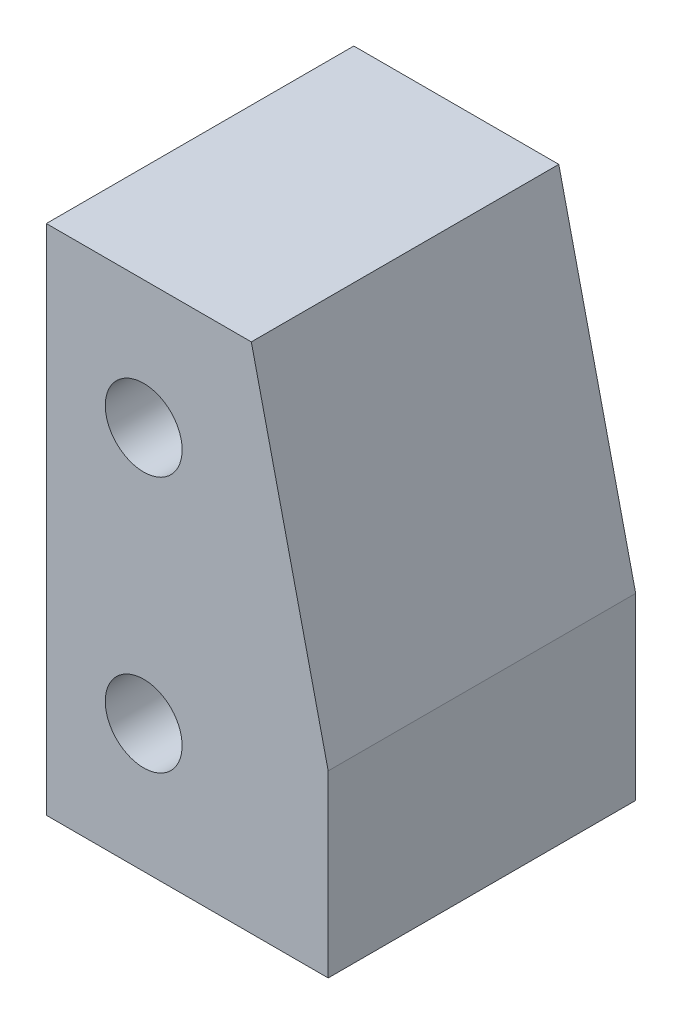
ISO-10303-21;
HEADER;
FILE_DESCRIPTION(('STEP AP214'),'2;1');
FILE_NAME('part.step','',(''),(''),'','','');
FILE_SCHEMA(('AUTOMOTIVE_DESIGN { 1 0 10303 214 1 1 1 1 }'));
ENDSEC;
DATA;
#1=APPLICATION_CONTEXT('core data for automotive mechanical design processes');
#2=APPLICATION_PROTOCOL_DEFINITION('international standard','automotive_design',2000,#1);
#3=PRODUCT_CONTEXT('',#1,'mechanical');
#4=PRODUCT('Part','Part','',(#3));
#5=PRODUCT_RELATED_PRODUCT_CATEGORY('part','',(#4));
#6=PRODUCT_DEFINITION_FORMATION('','',#4);
#7=PRODUCT_DEFINITION_CONTEXT('part definition',#1,'design');
#8=PRODUCT_DEFINITION('design','',#6,#7);
#9=PRODUCT_DEFINITION_SHAPE('','',#8);
#10=(LENGTH_UNIT() NAMED_UNIT(*) SI_UNIT(.MILLI.,.METRE.));
#11=(NAMED_UNIT(*) PLANE_ANGLE_UNIT() SI_UNIT($,.RADIAN.));
#12=(NAMED_UNIT(*) SI_UNIT($,.STERADIAN.) SOLID_ANGLE_UNIT());
#13=UNCERTAINTY_MEASURE_WITH_UNIT(LENGTH_MEASURE(1.E-05),#10,'distance_accuracy_value','');
#14=(GEOMETRIC_REPRESENTATION_CONTEXT(3) GLOBAL_UNCERTAINTY_ASSIGNED_CONTEXT((#13)) GLOBAL_UNIT_ASSIGNED_CONTEXT((#10,
#11,#12)) REPRESENTATION_CONTEXT('',''));
#15=CARTESIAN_POINT('',(0.,0.,0.));
#16=DIRECTION('',(0.,0.,1.));
#17=DIRECTION('',(1.,0.,0.));
#18=AXIS2_PLACEMENT_3D('',#15,#16,#17);
#19=CARTESIAN_POINT('',(0.,0.,12.));
#20=DIRECTION('',(0.,0.,-1.));
#21=DIRECTION('',(-1.,0.,0.));
#22=AXIS2_PLACEMENT_3D('',#19,#20,#21);
#23=PLANE('',#22);
#24=DIRECTION('',(0.,-1.,0.));
#25=VECTOR('',#24,1.);
#26=CARTESIAN_POINT('',(0.,0.,12.));
#27=LINE('',#26,#25);
#28=CARTESIAN_POINT('',(0.,20.,12.));
#29=VERTEX_POINT('',#28);
#30=CARTESIAN_POINT('',(0.,0.,12.));
#31=VERTEX_POINT('',#30);
#32=EDGE_CURVE('E129',#29,#31,#27,.T.);
#33=ORIENTED_EDGE('',*,*,#32,.T.);
#34=DIRECTION('',(1.,0.,0.));
#35=VECTOR('',#34,1.);
#36=CARTESIAN_POINT('',(0.,0.,12.));
#37=LINE('',#36,#35);
#38=CARTESIAN_POINT('',(11.,0.,12.));
#39=VERTEX_POINT('',#38);
#40=EDGE_CURVE('E76',#31,#39,#37,.T.);
#41=ORIENTED_EDGE('',*,*,#40,.T.);
#42=DIRECTION('',(0.,1.,0.));
#43=VECTOR('',#42,1.);
#44=CARTESIAN_POINT('',(11.,7.,12.));
#45=LINE('',#44,#43);
#46=CARTESIAN_POINT('',(11.,7.,12.));
#47=VERTEX_POINT('',#46);
#48=EDGE_CURVE('E111',#39,#47,#45,.T.);
#49=ORIENTED_EDGE('',*,*,#48,.T.);
#50=DIRECTION('',(-0.224859506698758,0.97439119569462,0.));
#51=VECTOR('',#50,1.);
#52=CARTESIAN_POINT('',(8.,20.,12.));
#53=LINE('',#52,#51);
#54=CARTESIAN_POINT('',(8.,20.,12.));
#55=VERTEX_POINT('',#54);
#56=EDGE_CURVE('E112',#47,#55,#53,.T.);
#57=ORIENTED_EDGE('',*,*,#56,.T.);
#58=DIRECTION('',(-1.,0.,0.));
#59=VECTOR('',#58,1.);
#60=CARTESIAN_POINT('',(0.,20.,12.));
#61=LINE('',#60,#59);
#62=EDGE_CURVE('E55',#55,#29,#61,.T.);
#63=ORIENTED_EDGE('',*,*,#62,.T.);
#64=EDGE_LOOP('',(#33,#41,#49,#57,#63));
#65=FACE_BOUND('',#64,.T.);
#66=CARTESIAN_POINT('',(3.80000000000003,15.,12.));
#67=DIRECTION('',(0.,0.,1.));
#68=DIRECTION('',(1.,0.,0.));
#69=AXIS2_PLACEMENT_3D('',#66,#67,#68);
#70=CIRCLE('',#69,1.5);
#71=CARTESIAN_POINT('',(5.30000000000003,15.,12.));
#72=VERTEX_POINT('',#71);
#73=EDGE_CURVE('E124',#72,#72,#70,.T.);
#74=ORIENTED_EDGE('',*,*,#73,.F.);
#75=EDGE_LOOP('',(#74));
#76=FACE_BOUND('',#75,.T.);
#77=CARTESIAN_POINT('',(3.80000000000003,5.,12.));
#78=DIRECTION('',(0.,0.,1.));
#79=DIRECTION('',(-1.,0.,0.));
#80=AXIS2_PLACEMENT_3D('',#77,#78,#79);
#81=CIRCLE('',#80,1.5);
#82=CARTESIAN_POINT('',(2.30000000000003,5.,12.));
#83=VERTEX_POINT('',#82);
#84=EDGE_CURVE('E117',#83,#83,#81,.T.);
#85=ORIENTED_EDGE('',*,*,#84,.F.);
#86=EDGE_LOOP('',(#85));
#87=FACE_BOUND('',#86,.T.);
#88=ADVANCED_FACE('F37',(#65,#76,#87),#23,.F.);
#89=CARTESIAN_POINT('',(0.,0.,0.));
#90=DIRECTION('',(0.,0.,-1.));
#91=DIRECTION('',(-1.,0.,0.));
#92=AXIS2_PLACEMENT_3D('',#89,#90,#91);
#93=PLANE('',#92);
#94=CARTESIAN_POINT('',(3.80000000000003,15.,0.));
#95=DIRECTION('',(0.,0.,1.));
#96=DIRECTION('',(1.,0.,0.));
#97=AXIS2_PLACEMENT_3D('',#94,#95,#96);
#98=CIRCLE('',#97,1.5);
#99=CARTESIAN_POINT('',(5.30000000000003,15.,0.));
#100=VERTEX_POINT('',#99);
#101=EDGE_CURVE('E120',#100,#100,#98,.T.);
#102=ORIENTED_EDGE('',*,*,#101,.T.);
#103=EDGE_LOOP('',(#102));
#104=FACE_BOUND('',#103,.T.);
#105=DIRECTION('',(0.,-1.,0.));
#106=VECTOR('',#105,1.);
#107=CARTESIAN_POINT('',(0.,0.,0.));
#108=LINE('',#107,#106);
#109=CARTESIAN_POINT('',(0.,20.,0.));
#110=VERTEX_POINT('',#109);
#111=CARTESIAN_POINT('',(0.,0.,0.));
#112=VERTEX_POINT('',#111);
#113=EDGE_CURVE('E97',#110,#112,#108,.T.);
#114=ORIENTED_EDGE('',*,*,#113,.F.);
#115=DIRECTION('',(-1.,0.,0.));
#116=VECTOR('',#115,1.);
#117=CARTESIAN_POINT('',(0.,20.,0.));
#118=LINE('',#117,#116);
#119=CARTESIAN_POINT('',(8.,20.,0.));
#120=VERTEX_POINT('',#119);
#121=EDGE_CURVE('E70',#120,#110,#118,.T.);
#122=ORIENTED_EDGE('',*,*,#121,.F.);
#123=DIRECTION('',(-0.224859506698758,0.97439119569462,0.));
#124=VECTOR('',#123,1.);
#125=CARTESIAN_POINT('',(8.,20.,0.));
#126=LINE('',#125,#124);
#127=CARTESIAN_POINT('',(11.,7.,0.));
#128=VERTEX_POINT('',#127);
#129=EDGE_CURVE('E104',#128,#120,#126,.T.);
#130=ORIENTED_EDGE('',*,*,#129,.F.);
#131=DIRECTION('',(0.,1.,0.));
#132=VECTOR('',#131,1.);
#133=CARTESIAN_POINT('',(11.,7.,0.));
#134=LINE('',#133,#132);
#135=CARTESIAN_POINT('',(11.,0.,0.));
#136=VERTEX_POINT('',#135);
#137=EDGE_CURVE('E100',#136,#128,#134,.T.);
#138=ORIENTED_EDGE('',*,*,#137,.F.);
#139=DIRECTION('',(1.,0.,0.));
#140=VECTOR('',#139,1.);
#141=CARTESIAN_POINT('',(0.,0.,0.));
#142=LINE('',#141,#140);
#143=EDGE_CURVE('E87',#112,#136,#142,.T.);
#144=ORIENTED_EDGE('',*,*,#143,.F.);
#145=EDGE_LOOP('',(#114,#122,#130,#138,#144));
#146=FACE_BOUND('',#145,.T.);
#147=CARTESIAN_POINT('',(3.80000000000003,5.,0.));
#148=DIRECTION('',(0.,0.,1.));
#149=DIRECTION('',(-1.,0.,0.));
#150=AXIS2_PLACEMENT_3D('',#147,#148,#149);
#151=CIRCLE('',#150,1.5);
#152=CARTESIAN_POINT('',(2.30000000000003,5.,0.));
#153=VERTEX_POINT('',#152);
#154=EDGE_CURVE('E121',#153,#153,#151,.T.);
#155=ORIENTED_EDGE('',*,*,#154,.T.);
#156=EDGE_LOOP('',(#155));
#157=FACE_BOUND('',#156,.T.);
#158=ADVANCED_FACE('F101',(#104,#146,#157),#93,.T.);
#159=CARTESIAN_POINT('',(0.,0.,12.));
#160=DIRECTION('',(1.,0.,0.));
#161=DIRECTION('',(0.,0.,-1.));
#162=AXIS2_PLACEMENT_3D('',#159,#160,#161);
#163=PLANE('',#162);
#164=ORIENTED_EDGE('',*,*,#113,.T.);
#165=DIRECTION('',(0.,0.,-1.));
#166=VECTOR('',#165,1.);
#167=CARTESIAN_POINT('',(0.,0.,12.));
#168=LINE('',#167,#166);
#169=EDGE_CURVE('E11',#31,#112,#168,.T.);
#170=ORIENTED_EDGE('',*,*,#169,.F.);
#171=ORIENTED_EDGE('',*,*,#32,.F.);
#172=DIRECTION('',(0.,0.,-1.));
#173=VECTOR('',#172,1.);
#174=CARTESIAN_POINT('',(0.,20.,12.));
#175=LINE('',#174,#173);
#176=EDGE_CURVE('E133',#29,#110,#175,.T.);
#177=ORIENTED_EDGE('',*,*,#176,.T.);
#178=EDGE_LOOP('',(#164,#170,#171,#177));
#179=FACE_BOUND('',#178,.T.);
#180=ADVANCED_FACE('F39',(#179),#163,.F.);
#181=CARTESIAN_POINT('',(0.,0.,12.));
#182=DIRECTION('',(0.,1.,0.));
#183=DIRECTION('',(0.,0.,1.));
#184=AXIS2_PLACEMENT_3D('',#181,#182,#183);
#185=PLANE('',#184);
#186=CARTESIAN_POINT('',(8.00000000000001,0.,6.));
#187=DIRECTION('',(0.,1.,0.));
#188=DIRECTION('',(0.,0.,1.));
#189=AXIS2_PLACEMENT_3D('',#186,#187,#188);
#190=CIRCLE('',#189,1.25);
#191=CARTESIAN_POINT('',(8.00000000000001,0.,7.25));
#192=VERTEX_POINT('',#191);
#193=EDGE_CURVE('E41',#192,#192,#190,.F.);
#194=ORIENTED_EDGE('',*,*,#193,.F.);
#195=EDGE_LOOP('',(#194));
#196=FACE_BOUND('',#195,.T.);
#197=ORIENTED_EDGE('',*,*,#143,.T.);
#198=DIRECTION('',(0.,0.,1.));
#199=VECTOR('',#198,1.);
#200=CARTESIAN_POINT('',(11.,0.,-20.2237484161567));
#201=LINE('',#200,#199);
#202=EDGE_CURVE('E91',#136,#39,#201,.T.);
#203=ORIENTED_EDGE('',*,*,#202,.T.);
#204=ORIENTED_EDGE('',*,*,#40,.F.);
#205=ORIENTED_EDGE('',*,*,#169,.T.);
#206=EDGE_LOOP('',(#197,#203,#204,#205));
#207=FACE_BOUND('',#206,.T.);
#208=ADVANCED_FACE('F89',(#196,#207),#185,.F.);
#209=CARTESIAN_POINT('',(0.,20.,12.));
#210=DIRECTION('',(0.,-1.,0.));
#211=DIRECTION('',(0.,0.,-1.));
#212=AXIS2_PLACEMENT_3D('',#209,#210,#211);
#213=PLANE('',#212);
#214=ORIENTED_EDGE('',*,*,#121,.T.);
#215=ORIENTED_EDGE('',*,*,#176,.F.);
#216=ORIENTED_EDGE('',*,*,#62,.F.);
#217=DIRECTION('',(0.,0.,-1.));
#218=VECTOR('',#217,1.);
#219=CARTESIAN_POINT('',(8.,20.,12.));
#220=LINE('',#219,#218);
#221=EDGE_CURVE('E47',#55,#120,#220,.T.);
#222=ORIENTED_EDGE('',*,*,#221,.T.);
#223=EDGE_LOOP('',(#214,#215,#216,#222));
#224=FACE_BOUND('',#223,.T.);
#225=ADVANCED_FACE('F155',(#224),#213,.F.);
#226=CARTESIAN_POINT('',(3.80000000000003,15.,12.));
#227=DIRECTION('',(0.,0.,-1.));
#228=DIRECTION('',(-1.,0.,0.));
#229=AXIS2_PLACEMENT_3D('',#226,#227,#228);
#230=CYLINDRICAL_SURFACE('',#229,1.5);
#231=ORIENTED_EDGE('',*,*,#73,.T.);
#232=EDGE_LOOP('',(#231));
#233=FACE_BOUND('',#232,.T.);
#234=ORIENTED_EDGE('',*,*,#101,.F.);
#235=EDGE_LOOP('',(#234));
#236=FACE_BOUND('',#235,.T.);
#237=ADVANCED_FACE('F160',(#233,#236),#230,.F.);
#238=CARTESIAN_POINT('',(3.80000000000003,5.,12.));
#239=DIRECTION('',(0.,0.,-1.));
#240=DIRECTION('',(-1.,0.,0.));
#241=AXIS2_PLACEMENT_3D('',#238,#239,#240);
#242=CYLINDRICAL_SURFACE('',#241,1.5);
#243=ORIENTED_EDGE('',*,*,#84,.T.);
#244=EDGE_LOOP('',(#243));
#245=FACE_BOUND('',#244,.T.);
#246=ORIENTED_EDGE('',*,*,#154,.F.);
#247=EDGE_LOOP('',(#246));
#248=FACE_BOUND('',#247,.T.);
#249=ADVANCED_FACE('F173',(#245,#248),#242,.F.);
#250=CARTESIAN_POINT('',(11.,7.,-20.2237484161567));
#251=DIRECTION('',(1.,0.,0.));
#252=DIRECTION('',(0.,0.,-1.));
#253=AXIS2_PLACEMENT_3D('',#250,#251,#252);
#254=PLANE('',#253);
#255=ORIENTED_EDGE('',*,*,#202,.F.);
#256=ORIENTED_EDGE('',*,*,#137,.T.);
#257=DIRECTION('',(0.,0.,1.));
#258=VECTOR('',#257,1.);
#259=CARTESIAN_POINT('',(11.,7.,-20.2237484161567));
#260=LINE('',#259,#258);
#261=EDGE_CURVE('E107',#128,#47,#260,.T.);
#262=ORIENTED_EDGE('',*,*,#261,.T.);
#263=ORIENTED_EDGE('',*,*,#48,.F.);
#264=EDGE_LOOP('',(#255,#256,#262,#263));
#265=FACE_BOUND('',#264,.T.);
#266=ADVANCED_FACE('F109',(#265),#254,.T.);
#267=CARTESIAN_POINT('',(8.,20.,-20.2237484161567));
#268=DIRECTION('',(0.97439119569462,0.224859506698758,0.));
#269=DIRECTION('',(-0.224859506698758,0.97439119569462,0.));
#270=AXIS2_PLACEMENT_3D('',#267,#268,#269);
#271=PLANE('',#270);
#272=ORIENTED_EDGE('',*,*,#261,.F.);
#273=ORIENTED_EDGE('',*,*,#129,.T.);
#274=ORIENTED_EDGE('',*,*,#221,.F.);
#275=ORIENTED_EDGE('',*,*,#56,.F.);
#276=EDGE_LOOP('',(#272,#273,#274,#275));
#277=FACE_BOUND('',#276,.T.);
#278=ADVANCED_FACE('F140',(#277),#271,.T.);
#279=CARTESIAN_POINT('',(8.00000000000001,-1.2E-05,6.));
#280=DIRECTION('',(0.,1.,0.));
#281=DIRECTION('',(0.,0.,1.));
#282=AXIS2_PLACEMENT_3D('',#279,#280,#281);
#283=CYLINDRICAL_SURFACE('',#282,1.25);
#284=CARTESIAN_POINT('',(8.00000000000001,7.,6.));
#285=DIRECTION('',(0.,-1.,0.));
#286=DIRECTION('',(0.,0.,-1.));
#287=AXIS2_PLACEMENT_3D('',#284,#285,#286);
#288=CIRCLE('',#287,1.25);
#289=CARTESIAN_POINT('',(8.00000000000001,7.,7.25));
#290=VERTEX_POINT('',#289);
#291=EDGE_CURVE('E145',#290,#290,#288,.T.);
#292=CARTESIAN_POINT('',(8.00000000000001,7.,7.25));
#293=CARTESIAN_POINT('',(8.00000000000001,6.92708333333333,7.25));
#294=CARTESIAN_POINT('',(8.00000000000001,6.85416666666667,7.25));
#295=CARTESIAN_POINT('',(8.00000000000001,6.70833333333333,7.25));
#296=CARTESIAN_POINT('',(8.00000000000001,6.63541666666667,7.25));
#297=CARTESIAN_POINT('',(8.00000000000001,6.48958333333333,7.25));
#298=CARTESIAN_POINT('',(8.00000000000001,6.41666666666667,7.25));
#299=CARTESIAN_POINT('',(8.00000000000001,6.27083333333333,7.25));
#300=CARTESIAN_POINT('',(8.00000000000001,6.19791666666667,7.25));
#301=CARTESIAN_POINT('',(8.00000000000001,6.05208333333333,7.25));
#302=CARTESIAN_POINT('',(8.00000000000001,5.97916666666667,7.25));
#303=CARTESIAN_POINT('',(8.00000000000001,5.83333333333333,7.25));
#304=CARTESIAN_POINT('',(8.00000000000001,5.76041666666667,7.25));
#305=CARTESIAN_POINT('',(8.00000000000001,5.61458333333333,7.25));
#306=CARTESIAN_POINT('',(8.00000000000001,5.54166666666667,7.25));
#307=CARTESIAN_POINT('',(8.00000000000001,5.39583333333333,7.25));
#308=CARTESIAN_POINT('',(8.00000000000001,5.32291666666667,7.25));
#309=CARTESIAN_POINT('',(8.00000000000001,5.17708333333333,7.25));
#310=CARTESIAN_POINT('',(8.00000000000001,5.10416666666667,7.25));
#311=CARTESIAN_POINT('',(8.00000000000001,4.95833333333333,7.25));
#312=CARTESIAN_POINT('',(8.00000000000001,4.88541666666667,7.25));
#313=CARTESIAN_POINT('',(8.00000000000001,4.73958333333333,7.25));
#314=CARTESIAN_POINT('',(8.00000000000001,4.66666666666667,7.25));
#315=CARTESIAN_POINT('',(8.00000000000001,4.52083333333333,7.25));
#316=CARTESIAN_POINT('',(8.00000000000001,4.44791666666667,7.25));
#317=CARTESIAN_POINT('',(8.00000000000001,4.30208333333333,7.25));
#318=CARTESIAN_POINT('',(8.00000000000001,4.22916666666667,7.25));
#319=CARTESIAN_POINT('',(8.00000000000001,4.08333333333333,7.25));
#320=CARTESIAN_POINT('',(8.00000000000001,4.01041666666667,7.25));
#321=CARTESIAN_POINT('',(8.00000000000001,3.86458333333333,7.25));
#322=CARTESIAN_POINT('',(8.00000000000001,3.79166666666667,7.25));
#323=CARTESIAN_POINT('',(8.00000000000001,3.64583333333333,7.25));
#324=CARTESIAN_POINT('',(8.00000000000001,3.57291666666667,7.25));
#325=CARTESIAN_POINT('',(8.00000000000001,3.42708333333333,7.25));
#326=CARTESIAN_POINT('',(8.00000000000001,3.35416666666667,7.25));
#327=CARTESIAN_POINT('',(8.00000000000001,3.20833333333333,7.25));
#328=CARTESIAN_POINT('',(8.00000000000001,3.13541666666667,7.25));
#329=CARTESIAN_POINT('',(8.00000000000001,2.98958333333333,7.25));
#330=CARTESIAN_POINT('',(8.00000000000001,2.91666666666667,7.25));
#331=CARTESIAN_POINT('',(8.00000000000001,2.77083333333333,7.25));
#332=CARTESIAN_POINT('',(8.00000000000001,2.69791666666667,7.25));
#333=CARTESIAN_POINT('',(8.00000000000001,2.55208333333333,7.25));
#334=CARTESIAN_POINT('',(8.00000000000001,2.47916666666667,7.25));
#335=CARTESIAN_POINT('',(8.00000000000001,2.33333333333333,7.25));
#336=CARTESIAN_POINT('',(8.00000000000001,2.26041666666667,7.25));
#337=CARTESIAN_POINT('',(8.00000000000001,2.11458333333333,7.25));
#338=CARTESIAN_POINT('',(8.00000000000001,2.04166666666667,7.25));
#339=CARTESIAN_POINT('',(8.00000000000001,1.89583333333333,7.25));
#340=CARTESIAN_POINT('',(8.00000000000001,1.82291666666667,7.25));
#341=CARTESIAN_POINT('',(8.00000000000001,1.67708333333333,7.25));
#342=CARTESIAN_POINT('',(8.00000000000001,1.60416666666667,7.25));
#343=CARTESIAN_POINT('',(8.00000000000001,1.45833333333333,7.25));
#344=CARTESIAN_POINT('',(8.00000000000001,1.38541666666667,7.25));
#345=CARTESIAN_POINT('',(8.00000000000001,1.23958333333333,7.25));
#346=CARTESIAN_POINT('',(8.00000000000001,1.16666666666667,7.25));
#347=CARTESIAN_POINT('',(8.00000000000001,1.02083333333333,7.25));
#348=CARTESIAN_POINT('',(8.00000000000001,0.947916666666666,7.25));
#349=CARTESIAN_POINT('',(8.00000000000001,0.802083333333333,7.25));
#350=CARTESIAN_POINT('',(8.00000000000001,0.729166666666667,7.25));
#351=CARTESIAN_POINT('',(8.00000000000001,0.583333333333333,7.25));
#352=CARTESIAN_POINT('',(8.00000000000001,0.510416666666667,7.25));
#353=CARTESIAN_POINT('',(8.00000000000001,0.364583333333333,7.25));
#354=CARTESIAN_POINT('',(8.00000000000001,0.291666666666667,7.25));
#355=CARTESIAN_POINT('',(8.00000000000001,0.145833333333333,7.25));
#356=CARTESIAN_POINT('',(8.00000000000001,0.0729166666666664,7.25));
#357=CARTESIAN_POINT('',(8.00000000000001,0.,7.25));
#358=B_SPLINE_CURVE_WITH_KNOTS('',3,(#292,#293,#294,#295,#296,#297,#298,#299,#300,#301,#302,
#303,#304,#305,#306,#307,#308,#309,#310,#311,#312,#313,#314,#315,#316,#317,#318,#319,#320,#321,
#322,#323,#324,#325,#326,#327,#328,#329,#330,#331,#332,#333,#334,#335,#336,#337,#338,#339,#340,
#341,#342,#343,#344,#345,#346,#347,#348,#349,#350,#351,#352,#353,#354,#355,#356,#357),
.UNSPECIFIED.,.F.,.F.,(4,2,2,2,2,2,2,2,2,2,2,2,2,2,2,2,2,2,2,2,2,2,2,2,2,2,2,2,2,2,2,2,4),(0.,
0.21875,0.4375,0.656250000000001,0.875,1.09375,1.3125,1.53125,1.75,1.96875,2.1875,2.40625,2.625,
2.84375,3.0625,3.28125,3.5,3.71875,3.9375,4.15625,4.375,4.59375,4.8125,5.03125,5.25,5.46875,
5.6875,5.90625,6.125,6.34375,6.5625,6.78125,7.),.UNSPECIFIED.);
#359=EDGE_CURVE('BSEAM152',#290,#192,#358,.T.);
#360=ORIENTED_EDGE('',*,*,#291,.F.);
#361=ORIENTED_EDGE('',*,*,#193,.T.);
#362=ORIENTED_EDGE('',*,*,#359,.T.);
#363=ORIENTED_EDGE('',*,*,#359,.F.);
#364=EDGE_LOOP('',(#360,#362,#361,#363));
#365=FACE_BOUND('',#364,.T.);
#366=ADVANCED_FACE('F152',(#365),#283,.F.);
#367=CARTESIAN_POINT('',(8.00000000000001,7.,6.));
#368=DIRECTION('',(0.,-1.,0.));
#369=DIRECTION('',(0.,0.,-1.));
#370=AXIS2_PLACEMENT_3D('',#367,#368,#369);
#371=PLANE('',#370);
#372=ORIENTED_EDGE('',*,*,#291,.T.);
#373=EDGE_LOOP('',(#372));
#374=FACE_BOUND('',#373,.T.);
#375=ADVANCED_FACE('F184',(#374),#371,.T.);
#376=CLOSED_SHELL('',(#88,#158,#180,#208,#225,#237,#249,#266,#278,#366,#375));
#377=MANIFOLD_SOLID_BREP('B2',#376);
#378=ADVANCED_BREP_SHAPE_REPRESENTATION('',(#18,#377),#14);
#379=SHAPE_DEFINITION_REPRESENTATION(#9,#378);
ENDSEC;
END-ISO-10303-21;
